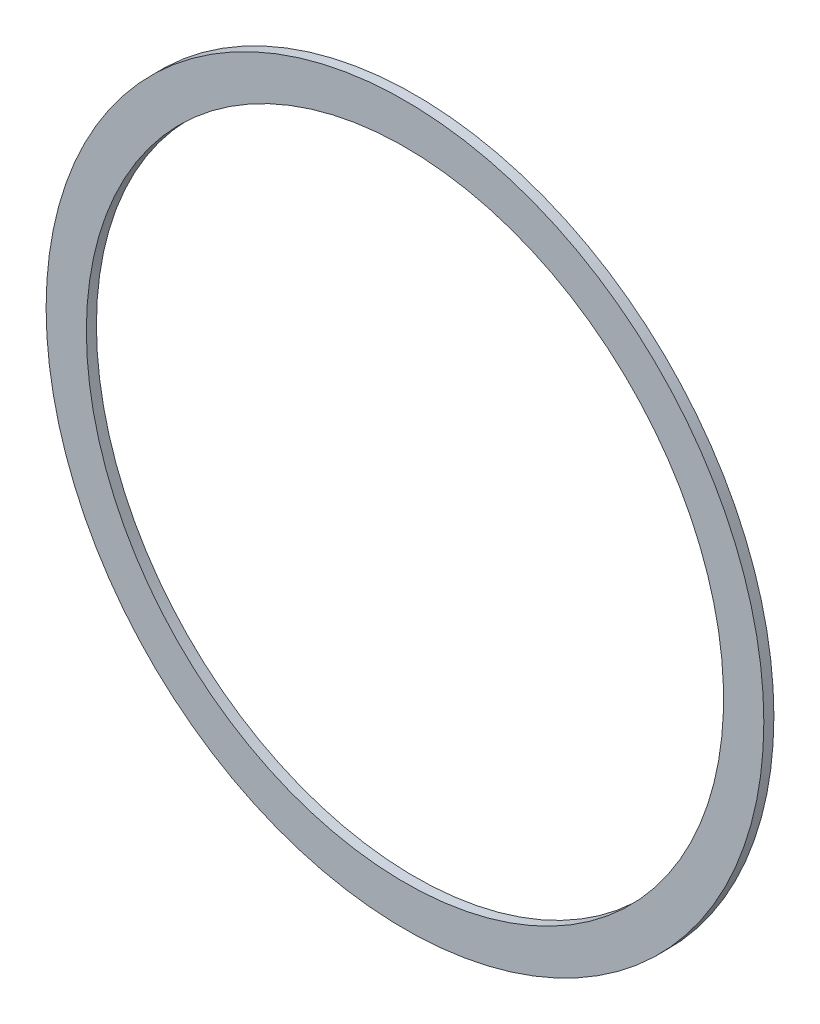
ISO-10303-21;
HEADER;
FILE_DESCRIPTION(('STEP AP214'),'2;1');
FILE_NAME('part.step','',(''),(''),'','','');
FILE_SCHEMA(('AUTOMOTIVE_DESIGN { 1 0 10303 214 1 1 1 1 }'));
ENDSEC;
DATA;
#1=APPLICATION_CONTEXT('core data for automotive mechanical design processes');
#2=APPLICATION_PROTOCOL_DEFINITION('international standard','automotive_design',2000,#1);
#3=PRODUCT_CONTEXT('',#1,'mechanical');
#4=PRODUCT('Part','Part','',(#3));
#5=PRODUCT_RELATED_PRODUCT_CATEGORY('part','',(#4));
#6=PRODUCT_DEFINITION_FORMATION('','',#4);
#7=PRODUCT_DEFINITION_CONTEXT('part definition',#1,'design');
#8=PRODUCT_DEFINITION('design','',#6,#7);
#9=PRODUCT_DEFINITION_SHAPE('','',#8);
#10=(LENGTH_UNIT() NAMED_UNIT(*) SI_UNIT(.MILLI.,.METRE.));
#11=(NAMED_UNIT(*) PLANE_ANGLE_UNIT() SI_UNIT($,.RADIAN.));
#12=(NAMED_UNIT(*) SI_UNIT($,.STERADIAN.) SOLID_ANGLE_UNIT());
#13=UNCERTAINTY_MEASURE_WITH_UNIT(LENGTH_MEASURE(1.E-05),#10,'distance_accuracy_value','');
#14=(GEOMETRIC_REPRESENTATION_CONTEXT(3) GLOBAL_UNCERTAINTY_ASSIGNED_CONTEXT((#13)) GLOBAL_UNIT_ASSIGNED_CONTEXT((#10,
#11,#12)) REPRESENTATION_CONTEXT('',''));
#15=CARTESIAN_POINT('',(0.,0.,0.));
#16=DIRECTION('',(0.,0.,1.));
#17=DIRECTION('',(1.,0.,0.));
#18=AXIS2_PLACEMENT_3D('',#15,#16,#17);
#19=CARTESIAN_POINT('',(0.,0.,0.762));
#20=DIRECTION('',(0.,0.,1.));
#21=DIRECTION('',(1.,0.,0.));
#22=AXIS2_PLACEMENT_3D('',#19,#20,#21);
#23=PLANE('',#22);
#24=CARTESIAN_POINT('',(0.,0.,0.762));
#25=DIRECTION('',(0.,0.,1.));
#26=DIRECTION('',(1.,0.,0.));
#27=AXIS2_PLACEMENT_3D('',#24,#25,#26);
#28=CIRCLE('',#27,27.178);
#29=CARTESIAN_POINT('',(-27.178,0.,0.762));
#30=VERTEX_POINT('',#29);
#31=EDGE_CURVE('E10',#30,#30,#28,.T.);
#32=ORIENTED_EDGE('',*,*,#31,.T.);
#33=EDGE_LOOP('',(#32));
#34=FACE_BOUND('',#33,.T.);
#35=CARTESIAN_POINT('',(0.,0.,0.762));
#36=DIRECTION('',(0.,0.,1.));
#37=DIRECTION('',(1.,0.,0.));
#38=AXIS2_PLACEMENT_3D('',#35,#36,#37);
#39=CIRCLE('',#38,24.13);
#40=CARTESIAN_POINT('',(-24.13,0.,0.762));
#41=VERTEX_POINT('',#40);
#42=EDGE_CURVE('E43',#41,#41,#39,.T.);
#43=ORIENTED_EDGE('',*,*,#42,.F.);
#44=EDGE_LOOP('',(#43));
#45=FACE_BOUND('',#44,.T.);
#46=ADVANCED_FACE('F32',(#34,#45),#23,.T.);
#47=CARTESIAN_POINT('',(0.,0.,0.));
#48=DIRECTION('',(0.,0.,1.));
#49=DIRECTION('',(1.,0.,0.));
#50=AXIS2_PLACEMENT_3D('',#47,#48,#49);
#51=PLANE('',#50);
#52=CARTESIAN_POINT('',(0.,0.,0.));
#53=DIRECTION('',(0.,0.,1.));
#54=DIRECTION('',(1.,0.,0.));
#55=AXIS2_PLACEMENT_3D('',#52,#53,#54);
#56=CIRCLE('',#55,27.178);
#57=CARTESIAN_POINT('',(-27.178,0.,0.));
#58=VERTEX_POINT('',#57);
#59=EDGE_CURVE('E36',#58,#58,#56,.T.);
#60=ORIENTED_EDGE('',*,*,#59,.F.);
#61=EDGE_LOOP('',(#60));
#62=FACE_BOUND('',#61,.T.);
#63=CARTESIAN_POINT('',(0.,0.,0.));
#64=DIRECTION('',(0.,0.,1.));
#65=DIRECTION('',(1.,0.,0.));
#66=AXIS2_PLACEMENT_3D('',#63,#64,#65);
#67=CIRCLE('',#66,24.13);
#68=CARTESIAN_POINT('',(-24.13,0.,0.));
#69=VERTEX_POINT('',#68);
#70=EDGE_CURVE('E45',#69,#69,#67,.T.);
#71=ORIENTED_EDGE('',*,*,#70,.T.);
#72=EDGE_LOOP('',(#71));
#73=FACE_BOUND('',#72,.T.);
#74=ADVANCED_FACE('F55',(#62,#73),#51,.F.);
#75=CARTESIAN_POINT('',(0.,0.,0.762));
#76=DIRECTION('',(0.,0.,-1.));
#77=DIRECTION('',(-1.,0.,0.));
#78=AXIS2_PLACEMENT_3D('',#75,#76,#77);
#79=CYLINDRICAL_SURFACE('',#78,27.178);
#80=CARTESIAN_POINT('',(-27.178,0.,0.762));
#81=CARTESIAN_POINT('',(-27.178,0.,0.7540625));
#82=CARTESIAN_POINT('',(-27.178,0.,0.746125));
#83=CARTESIAN_POINT('',(-27.178,0.,0.73025));
#84=CARTESIAN_POINT('',(-27.178,0.,0.7223125));
#85=CARTESIAN_POINT('',(-27.178,0.,0.7064375));
#86=CARTESIAN_POINT('',(-27.178,0.,0.6985));
#87=CARTESIAN_POINT('',(-27.178,0.,0.682625));
#88=CARTESIAN_POINT('',(-27.178,0.,0.6746875));
#89=CARTESIAN_POINT('',(-27.178,0.,0.6588125));
#90=CARTESIAN_POINT('',(-27.178,0.,0.650875));
#91=CARTESIAN_POINT('',(-27.178,0.,0.635));
#92=CARTESIAN_POINT('',(-27.178,0.,0.6270625));
#93=CARTESIAN_POINT('',(-27.178,0.,0.6111875));
#94=CARTESIAN_POINT('',(-27.178,0.,0.60325));
#95=CARTESIAN_POINT('',(-27.178,0.,0.587375));
#96=CARTESIAN_POINT('',(-27.178,0.,0.5794375));
#97=CARTESIAN_POINT('',(-27.178,0.,0.5635625));
#98=CARTESIAN_POINT('',(-27.178,0.,0.555625));
#99=CARTESIAN_POINT('',(-27.178,0.,0.53975));
#100=CARTESIAN_POINT('',(-27.178,0.,0.5318125));
#101=CARTESIAN_POINT('',(-27.178,0.,0.5159375));
#102=CARTESIAN_POINT('',(-27.178,0.,0.508));
#103=CARTESIAN_POINT('',(-27.178,0.,0.492125));
#104=CARTESIAN_POINT('',(-27.178,0.,0.4841875));
#105=CARTESIAN_POINT('',(-27.178,0.,0.4683125));
#106=CARTESIAN_POINT('',(-27.178,0.,0.460375));
#107=CARTESIAN_POINT('',(-27.178,0.,0.4445));
#108=CARTESIAN_POINT('',(-27.178,0.,0.4365625));
#109=CARTESIAN_POINT('',(-27.178,0.,0.4206875));
#110=CARTESIAN_POINT('',(-27.178,0.,0.41275));
#111=CARTESIAN_POINT('',(-27.178,0.,0.396875));
#112=CARTESIAN_POINT('',(-27.178,0.,0.3889375));
#113=CARTESIAN_POINT('',(-27.178,0.,0.3730625));
#114=CARTESIAN_POINT('',(-27.178,0.,0.365125));
#115=CARTESIAN_POINT('',(-27.178,0.,0.34925));
#116=CARTESIAN_POINT('',(-27.178,0.,0.3413125));
#117=CARTESIAN_POINT('',(-27.178,0.,0.3254375));
#118=CARTESIAN_POINT('',(-27.178,0.,0.3175));
#119=CARTESIAN_POINT('',(-27.178,0.,0.301625));
#120=CARTESIAN_POINT('',(-27.178,0.,0.2936875));
#121=CARTESIAN_POINT('',(-27.178,0.,0.2778125));
#122=CARTESIAN_POINT('',(-27.178,0.,0.269875));
#123=CARTESIAN_POINT('',(-27.178,0.,0.254));
#124=CARTESIAN_POINT('',(-27.178,0.,0.2460625));
#125=CARTESIAN_POINT('',(-27.178,0.,0.2301875));
#126=CARTESIAN_POINT('',(-27.178,0.,0.22225));
#127=CARTESIAN_POINT('',(-27.178,0.,0.206375));
#128=CARTESIAN_POINT('',(-27.178,0.,0.1984375));
#129=CARTESIAN_POINT('',(-27.178,0.,0.1825625));
#130=CARTESIAN_POINT('',(-27.178,0.,0.174625));
#131=CARTESIAN_POINT('',(-27.178,0.,0.15875));
#132=CARTESIAN_POINT('',(-27.178,0.,0.1508125));
#133=CARTESIAN_POINT('',(-27.178,0.,0.1349375));
#134=CARTESIAN_POINT('',(-27.178,0.,0.127));
#135=CARTESIAN_POINT('',(-27.178,0.,0.111125));
#136=CARTESIAN_POINT('',(-27.178,0.,0.1031875));
#137=CARTESIAN_POINT('',(-27.178,0.,0.0873125));
#138=CARTESIAN_POINT('',(-27.178,0.,0.079375));
#139=CARTESIAN_POINT('',(-27.178,0.,0.0635));
#140=CARTESIAN_POINT('',(-27.178,0.,0.0555625));
#141=CARTESIAN_POINT('',(-27.178,0.,0.0396875));
#142=CARTESIAN_POINT('',(-27.178,0.,0.03175));
#143=CARTESIAN_POINT('',(-27.178,0.,0.015875));
#144=CARTESIAN_POINT('',(-27.178,0.,0.00793749999999999));
#145=CARTESIAN_POINT('',(-27.178,0.,0.));
#146=B_SPLINE_CURVE_WITH_KNOTS('',3,(#80,#81,#82,#83,#84,#85,#86,#87,#88,#89,#90,#91,#92,#93,
#94,#95,#96,#97,#98,#99,#100,#101,#102,#103,#104,#105,#106,#107,#108,#109,#110,#111,#112,#113,
#114,#115,#116,#117,#118,#119,#120,#121,#122,#123,#124,#125,#126,#127,#128,#129,#130,#131,#132,
#133,#134,#135,#136,#137,#138,#139,#140,#141,#142,#143,#144,#145),.UNSPECIFIED.,.F.,.F.,(4,2,2,
2,2,2,2,2,2,2,2,2,2,2,2,2,2,2,2,2,2,2,2,2,2,2,2,2,2,2,2,2,4),(0.,0.0238125000000001,0.047625,
0.0714375,0.0952500000000001,0.1190625,0.142875,0.1666875,0.1905,0.2143125,0.238125,0.2619375,
0.28575,0.3095625,0.333375,0.3571875,0.381,0.4048125,0.428625,0.4524375,0.47625,0.5000625,
0.523875,0.5476875,0.5715,0.5953125,0.619125,0.6429375,0.66675,0.6905625,0.714375,0.7381875,
0.762),.UNSPECIFIED.);
#147=EDGE_CURVE('BSEAM34',#30,#58,#146,.T.);
#148=ORIENTED_EDGE('',*,*,#31,.F.);
#149=ORIENTED_EDGE('',*,*,#59,.T.);
#150=ORIENTED_EDGE('',*,*,#147,.T.);
#151=ORIENTED_EDGE('',*,*,#147,.F.);
#152=EDGE_LOOP('',(#148,#150,#149,#151));
#153=FACE_BOUND('',#152,.T.);
#154=ADVANCED_FACE('F34',(#153),#79,.T.);
#155=CARTESIAN_POINT('',(0.,0.,0.762));
#156=DIRECTION('',(0.,0.,-1.));
#157=DIRECTION('',(-1.,0.,0.));
#158=AXIS2_PLACEMENT_3D('',#155,#156,#157);
#159=CYLINDRICAL_SURFACE('',#158,24.13);
#160=CARTESIAN_POINT('',(-24.13,0.,0.762));
#161=CARTESIAN_POINT('',(-24.13,0.,0.7540625));
#162=CARTESIAN_POINT('',(-24.13,0.,0.746125));
#163=CARTESIAN_POINT('',(-24.13,0.,0.73025));
#164=CARTESIAN_POINT('',(-24.13,0.,0.7223125));
#165=CARTESIAN_POINT('',(-24.13,0.,0.7064375));
#166=CARTESIAN_POINT('',(-24.13,0.,0.6985));
#167=CARTESIAN_POINT('',(-24.13,0.,0.682625));
#168=CARTESIAN_POINT('',(-24.13,0.,0.6746875));
#169=CARTESIAN_POINT('',(-24.13,0.,0.6588125));
#170=CARTESIAN_POINT('',(-24.13,0.,0.650875));
#171=CARTESIAN_POINT('',(-24.13,0.,0.635));
#172=CARTESIAN_POINT('',(-24.13,0.,0.6270625));
#173=CARTESIAN_POINT('',(-24.13,0.,0.6111875));
#174=CARTESIAN_POINT('',(-24.13,0.,0.60325));
#175=CARTESIAN_POINT('',(-24.13,0.,0.587375));
#176=CARTESIAN_POINT('',(-24.13,0.,0.5794375));
#177=CARTESIAN_POINT('',(-24.13,0.,0.5635625));
#178=CARTESIAN_POINT('',(-24.13,0.,0.555625));
#179=CARTESIAN_POINT('',(-24.13,0.,0.53975));
#180=CARTESIAN_POINT('',(-24.13,0.,0.5318125));
#181=CARTESIAN_POINT('',(-24.13,0.,0.5159375));
#182=CARTESIAN_POINT('',(-24.13,0.,0.508));
#183=CARTESIAN_POINT('',(-24.13,0.,0.492125));
#184=CARTESIAN_POINT('',(-24.13,0.,0.4841875));
#185=CARTESIAN_POINT('',(-24.13,0.,0.4683125));
#186=CARTESIAN_POINT('',(-24.13,0.,0.460375));
#187=CARTESIAN_POINT('',(-24.13,0.,0.4445));
#188=CARTESIAN_POINT('',(-24.13,0.,0.4365625));
#189=CARTESIAN_POINT('',(-24.13,0.,0.4206875));
#190=CARTESIAN_POINT('',(-24.13,0.,0.41275));
#191=CARTESIAN_POINT('',(-24.13,0.,0.396875));
#192=CARTESIAN_POINT('',(-24.13,0.,0.3889375));
#193=CARTESIAN_POINT('',(-24.13,0.,0.3730625));
#194=CARTESIAN_POINT('',(-24.13,0.,0.365125));
#195=CARTESIAN_POINT('',(-24.13,0.,0.34925));
#196=CARTESIAN_POINT('',(-24.13,0.,0.3413125));
#197=CARTESIAN_POINT('',(-24.13,0.,0.3254375));
#198=CARTESIAN_POINT('',(-24.13,0.,0.3175));
#199=CARTESIAN_POINT('',(-24.13,0.,0.301625));
#200=CARTESIAN_POINT('',(-24.13,0.,0.2936875));
#201=CARTESIAN_POINT('',(-24.13,0.,0.2778125));
#202=CARTESIAN_POINT('',(-24.13,0.,0.269875));
#203=CARTESIAN_POINT('',(-24.13,0.,0.254));
#204=CARTESIAN_POINT('',(-24.13,0.,0.2460625));
#205=CARTESIAN_POINT('',(-24.13,0.,0.2301875));
#206=CARTESIAN_POINT('',(-24.13,0.,0.22225));
#207=CARTESIAN_POINT('',(-24.13,0.,0.206375));
#208=CARTESIAN_POINT('',(-24.13,0.,0.1984375));
#209=CARTESIAN_POINT('',(-24.13,0.,0.1825625));
#210=CARTESIAN_POINT('',(-24.13,0.,0.174625));
#211=CARTESIAN_POINT('',(-24.13,0.,0.15875));
#212=CARTESIAN_POINT('',(-24.13,0.,0.1508125));
#213=CARTESIAN_POINT('',(-24.13,0.,0.1349375));
#214=CARTESIAN_POINT('',(-24.13,0.,0.127));
#215=CARTESIAN_POINT('',(-24.13,0.,0.111125));
#216=CARTESIAN_POINT('',(-24.13,0.,0.1031875));
#217=CARTESIAN_POINT('',(-24.13,0.,0.0873125));
#218=CARTESIAN_POINT('',(-24.13,0.,0.079375));
#219=CARTESIAN_POINT('',(-24.13,0.,0.0635));
#220=CARTESIAN_POINT('',(-24.13,0.,0.0555625));
#221=CARTESIAN_POINT('',(-24.13,0.,0.0396875));
#222=CARTESIAN_POINT('',(-24.13,0.,0.03175));
#223=CARTESIAN_POINT('',(-24.13,0.,0.015875));
#224=CARTESIAN_POINT('',(-24.13,0.,0.00793749999999999));
#225=CARTESIAN_POINT('',(-24.13,0.,0.));
#226=B_SPLINE_CURVE_WITH_KNOTS('',3,(#160,#161,#162,#163,#164,#165,#166,#167,#168,#169,#170,
#171,#172,#173,#174,#175,#176,#177,#178,#179,#180,#181,#182,#183,#184,#185,#186,#187,#188,#189,
#190,#191,#192,#193,#194,#195,#196,#197,#198,#199,#200,#201,#202,#203,#204,#205,#206,#207,#208,
#209,#210,#211,#212,#213,#214,#215,#216,#217,#218,#219,#220,#221,#222,#223,#224,#225),
.UNSPECIFIED.,.F.,.F.,(4,2,2,2,2,2,2,2,2,2,2,2,2,2,2,2,2,2,2,2,2,2,2,2,2,2,2,2,2,2,2,2,4),(0.,
0.0238125,0.0476249999999999,0.0714374999999999,0.09525,0.1190625,0.142875,0.1666875,0.1905,
0.2143125,0.238125,0.2619375,0.28575,0.3095625,0.333375,0.3571875,0.381,0.4048125,0.428625,
0.4524375,0.47625,0.5000625,0.523875,0.5476875,0.5715,0.5953125,0.619125,0.6429375,0.66675,
0.6905625,0.714375,0.7381875,0.762),.UNSPECIFIED.);
#227=EDGE_CURVE('BSEAM51',#41,#69,#226,.T.);
#228=ORIENTED_EDGE('',*,*,#42,.T.);
#229=ORIENTED_EDGE('',*,*,#70,.F.);
#230=ORIENTED_EDGE('',*,*,#227,.T.);
#231=ORIENTED_EDGE('',*,*,#227,.F.);
#232=EDGE_LOOP('',(#228,#230,#229,#231));
#233=FACE_BOUND('',#232,.T.);
#234=ADVANCED_FACE('F51',(#233),#159,.F.);
#235=CLOSED_SHELL('',(#46,#74,#154,#234));
#236=MANIFOLD_SOLID_BREP('B2',#235);
#237=ADVANCED_BREP_SHAPE_REPRESENTATION('',(#18,#236),#14);
#238=SHAPE_DEFINITION_REPRESENTATION(#9,#237);
ENDSEC;
END-ISO-10303-21;
